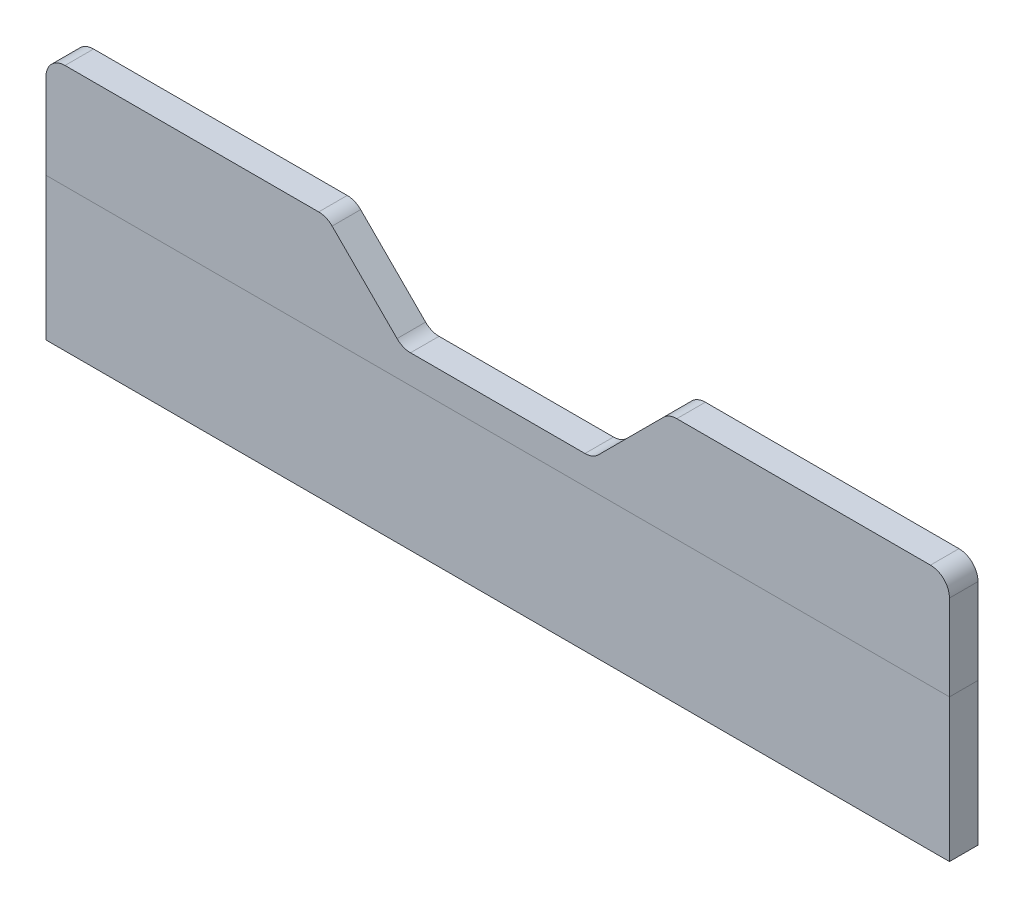
ISO-10303-21;
HEADER;
FILE_DESCRIPTION(('STEP AP214'),'2;1');
FILE_NAME('part.step','',(''),(''),'','','');
FILE_SCHEMA(('AUTOMOTIVE_DESIGN { 1 0 10303 214 1 1 1 1 }'));
ENDSEC;
DATA;
#1=APPLICATION_CONTEXT('core data for automotive mechanical design processes');
#2=APPLICATION_PROTOCOL_DEFINITION('international standard','automotive_design',2000,#1);
#3=PRODUCT_CONTEXT('',#1,'mechanical');
#4=PRODUCT('Part','Part','',(#3));
#5=PRODUCT_RELATED_PRODUCT_CATEGORY('part','',(#4));
#6=PRODUCT_DEFINITION_FORMATION('','',#4);
#7=PRODUCT_DEFINITION_CONTEXT('part definition',#1,'design');
#8=PRODUCT_DEFINITION('design','',#6,#7);
#9=PRODUCT_DEFINITION_SHAPE('','',#8);
#10=(LENGTH_UNIT() NAMED_UNIT(*) SI_UNIT(.MILLI.,.METRE.));
#11=(NAMED_UNIT(*) PLANE_ANGLE_UNIT() SI_UNIT($,.RADIAN.));
#12=(NAMED_UNIT(*) SI_UNIT($,.STERADIAN.) SOLID_ANGLE_UNIT());
#13=UNCERTAINTY_MEASURE_WITH_UNIT(LENGTH_MEASURE(1.E-05),#10,'distance_accuracy_value','');
#14=(GEOMETRIC_REPRESENTATION_CONTEXT(3) GLOBAL_UNCERTAINTY_ASSIGNED_CONTEXT((#13)) GLOBAL_UNIT_ASSIGNED_CONTEXT((#10,
#11,#12)) REPRESENTATION_CONTEXT('',''));
#15=CARTESIAN_POINT('',(0.,0.,0.));
#16=DIRECTION('',(0.,0.,1.));
#17=DIRECTION('',(1.,0.,0.));
#18=AXIS2_PLACEMENT_3D('',#15,#16,#17);
#19=CARTESIAN_POINT('',(0.,75.,-15.));
#20=DIRECTION('',(-1.,0.,0.));
#21=DIRECTION('',(0.,0.,1.));
#22=AXIS2_PLACEMENT_3D('',#19,#20,#21);
#23=PLANE('',#22);
#24=DIRECTION('',(0.,-1.,0.));
#25=VECTOR('',#24,1.);
#26=CARTESIAN_POINT('',(0.,75.,0.));
#27=LINE('',#26,#25);
#28=CARTESIAN_POINT('',(0.,120.,0.));
#29=VERTEX_POINT('',#28);
#30=CARTESIAN_POINT('',(0.,75.,0.));
#31=VERTEX_POINT('',#30);
#32=EDGE_CURVE('E196',#29,#31,#27,.T.);
#33=ORIENTED_EDGE('',*,*,#32,.F.);
#34=DIRECTION('',(0.,0.,1.));
#35=VECTOR('',#34,1.);
#36=CARTESIAN_POINT('',(0.,120.,-15.));
#37=LINE('',#36,#35);
#38=CARTESIAN_POINT('',(0.,120.,-15.));
#39=VERTEX_POINT('',#38);
#40=EDGE_CURVE('E162',#29,#39,#37,.F.);
#41=ORIENTED_EDGE('',*,*,#40,.T.);
#42=DIRECTION('',(0.,-1.,0.));
#43=VECTOR('',#42,1.);
#44=CARTESIAN_POINT('',(0.,75.,-15.));
#45=LINE('',#44,#43);
#46=CARTESIAN_POINT('',(0.,75.,-15.));
#47=VERTEX_POINT('',#46);
#48=EDGE_CURVE('E160',#39,#47,#45,.T.);
#49=ORIENTED_EDGE('',*,*,#48,.T.);
#50=DIRECTION('',(0.,0.,1.));
#51=VECTOR('',#50,1.);
#52=CARTESIAN_POINT('',(0.,75.,-15.));
#53=LINE('',#52,#51);
#54=EDGE_CURVE('E159',#47,#31,#53,.T.);
#55=ORIENTED_EDGE('',*,*,#54,.T.);
#56=EDGE_LOOP('',(#33,#41,#49,#55));
#57=FACE_BOUND('',#56,.T.);
#58=ADVANCED_FACE('F54',(#57),#23,.T.);
#59=CARTESIAN_POINT('',(0.,130.,-15.));
#60=DIRECTION('',(0.,1.,0.));
#61=DIRECTION('',(0.,0.,1.));
#62=AXIS2_PLACEMENT_3D('',#59,#60,#61);
#63=PLANE('',#62);
#64=DIRECTION('',(-1.,0.,0.));
#65=VECTOR('',#64,1.);
#66=CARTESIAN_POINT('',(0.,130.,-15.));
#67=LINE('',#66,#65);
#68=CARTESIAN_POINT('',(143.357864376269,130.,-15.));
#69=VERTEX_POINT('',#68);
#70=CARTESIAN_POINT('',(9.99999999999999,130.,-15.));
#71=VERTEX_POINT('',#70);
#72=EDGE_CURVE('E174',#69,#71,#67,.T.);
#73=ORIENTED_EDGE('',*,*,#72,.T.);
#74=DIRECTION('',(0.,0.,1.));
#75=VECTOR('',#74,1.);
#76=CARTESIAN_POINT('',(10.,130.,-15.));
#77=LINE('',#76,#75);
#78=CARTESIAN_POINT('',(9.99999999999999,130.,0.));
#79=VERTEX_POINT('',#78);
#80=EDGE_CURVE('E244',#71,#79,#77,.T.);
#81=ORIENTED_EDGE('',*,*,#80,.T.);
#82=DIRECTION('',(-1.,0.,0.));
#83=VECTOR('',#82,1.);
#84=CARTESIAN_POINT('',(0.,130.,0.));
#85=LINE('',#84,#83);
#86=CARTESIAN_POINT('',(143.357864376269,130.,0.));
#87=VERTEX_POINT('',#86);
#88=EDGE_CURVE('E170',#87,#79,#85,.T.);
#89=ORIENTED_EDGE('',*,*,#88,.F.);
#90=DIRECTION('',(0.,0.,1.));
#91=VECTOR('',#90,1.);
#92=CARTESIAN_POINT('',(143.357864376269,130.,-15.));
#93=LINE('',#92,#91);
#94=EDGE_CURVE('E242',#87,#69,#93,.F.);
#95=ORIENTED_EDGE('',*,*,#94,.T.);
#96=EDGE_LOOP('',(#73,#81,#89,#95));
#97=FACE_BOUND('',#96,.T.);
#98=ADVANCED_FACE('F308',(#97),#63,.T.);
#99=CARTESIAN_POINT('',(147.5,130.,-15.));
#100=DIRECTION('',(0.707106781186551,0.707106781186544,0.));
#101=DIRECTION('',(-0.707106781186544,0.707106781186551,0.));
#102=AXIS2_PLACEMENT_3D('',#99,#100,#101);
#103=PLANE('',#102);
#104=DIRECTION('',(-0.707106781186544,0.707106781186552,0.));
#105=VECTOR('',#104,1.);
#106=CARTESIAN_POINT('',(147.5,130.,0.));
#107=LINE('',#106,#105);
#108=CARTESIAN_POINT('',(184.571067811865,92.9289321881346,0.));
#109=VERTEX_POINT('',#108);
#110=CARTESIAN_POINT('',(150.428932188135,127.071067811865,0.));
#111=VERTEX_POINT('',#110);
#112=EDGE_CURVE('E213',#109,#111,#107,.T.);
#113=ORIENTED_EDGE('',*,*,#112,.F.);
#114=DIRECTION('',(0.,0.,1.));
#115=VECTOR('',#114,1.);
#116=CARTESIAN_POINT('',(184.571067811865,92.9289321881346,-15.));
#117=LINE('',#116,#115);
#118=CARTESIAN_POINT('',(184.571067811865,92.9289321881346,-15.));
#119=VERTEX_POINT('',#118);
#120=EDGE_CURVE('E261',#109,#119,#117,.F.);
#121=ORIENTED_EDGE('',*,*,#120,.T.);
#122=DIRECTION('',(-0.707106781186544,0.707106781186552,0.));
#123=VECTOR('',#122,1.);
#124=CARTESIAN_POINT('',(147.5,130.,-15.));
#125=LINE('',#124,#123);
#126=CARTESIAN_POINT('',(150.428932188135,127.071067811865,-15.));
#127=VERTEX_POINT('',#126);
#128=EDGE_CURVE('E194',#119,#127,#125,.T.);
#129=ORIENTED_EDGE('',*,*,#128,.T.);
#130=DIRECTION('',(0.,0.,1.));
#131=VECTOR('',#130,1.);
#132=CARTESIAN_POINT('',(150.428932188135,127.071067811865,-15.));
#133=LINE('',#132,#131);
#134=EDGE_CURVE('E256',#127,#111,#133,.T.);
#135=ORIENTED_EDGE('',*,*,#134,.T.);
#136=EDGE_LOOP('',(#113,#121,#129,#135));
#137=FACE_BOUND('',#136,.T.);
#138=ADVANCED_FACE('F272',(#137),#103,.T.);
#139=CARTESIAN_POINT('',(187.5,90.,-15.));
#140=DIRECTION('',(0.,1.,0.));
#141=DIRECTION('',(0.,0.,1.));
#142=AXIS2_PLACEMENT_3D('',#139,#140,#141);
#143=PLANE('',#142);
#144=DIRECTION('',(-1.,0.,0.));
#145=VECTOR('',#144,1.);
#146=CARTESIAN_POINT('',(187.5,90.,0.));
#147=LINE('',#146,#145);
#148=CARTESIAN_POINT('',(283.357864376269,90.,0.));
#149=VERTEX_POINT('',#148);
#150=CARTESIAN_POINT('',(191.642135623731,90.,0.));
#151=VERTEX_POINT('',#150);
#152=EDGE_CURVE('E209',#149,#151,#147,.T.);
#153=ORIENTED_EDGE('',*,*,#152,.F.);
#154=DIRECTION('',(0.,0.,1.));
#155=VECTOR('',#154,1.);
#156=CARTESIAN_POINT('',(283.357864376269,90.,-15.));
#157=LINE('',#156,#155);
#158=CARTESIAN_POINT('',(283.357864376269,90.,-15.));
#159=VERTEX_POINT('',#158);
#160=EDGE_CURVE('E258',#149,#159,#157,.F.);
#161=ORIENTED_EDGE('',*,*,#160,.T.);
#162=DIRECTION('',(-1.,0.,0.));
#163=VECTOR('',#162,1.);
#164=CARTESIAN_POINT('',(187.5,90.,-15.));
#165=LINE('',#164,#163);
#166=CARTESIAN_POINT('',(191.642135623731,90.,-15.));
#167=VERTEX_POINT('',#166);
#168=EDGE_CURVE('E189',#159,#167,#165,.T.);
#169=ORIENTED_EDGE('',*,*,#168,.T.);
#170=DIRECTION('',(0.,0.,1.));
#171=VECTOR('',#170,1.);
#172=CARTESIAN_POINT('',(191.642135623731,90.,0.));
#173=LINE('',#172,#171);
#174=EDGE_CURVE('E251',#167,#151,#173,.T.);
#175=ORIENTED_EDGE('',*,*,#174,.T.);
#176=EDGE_LOOP('',(#153,#161,#169,#175));
#177=FACE_BOUND('',#176,.T.);
#178=ADVANCED_FACE('F276',(#177),#143,.T.);
#179=CARTESIAN_POINT('',(327.5,130.,-15.));
#180=DIRECTION('',(-0.707106781186544,0.707106781186551,0.));
#181=DIRECTION('',(-0.707106781186551,-0.707106781186544,0.));
#182=AXIS2_PLACEMENT_3D('',#179,#180,#181);
#183=PLANE('',#182);
#184=DIRECTION('',(-0.707106781186551,-0.707106781186544,0.));
#185=VECTOR('',#184,1.);
#186=CARTESIAN_POINT('',(327.5,130.,0.));
#187=LINE('',#186,#185);
#188=CARTESIAN_POINT('',(324.571067811866,127.071067811866,0.));
#189=VERTEX_POINT('',#188);
#190=CARTESIAN_POINT('',(290.428932188135,92.9289321881345,0.));
#191=VERTEX_POINT('',#190);
#192=EDGE_CURVE('E210',#189,#191,#187,.T.);
#193=ORIENTED_EDGE('',*,*,#192,.F.);
#194=DIRECTION('',(0.,0.,1.));
#195=VECTOR('',#194,1.);
#196=CARTESIAN_POINT('',(324.571067811866,127.071067811866,-15.));
#197=LINE('',#196,#195);
#198=CARTESIAN_POINT('',(324.571067811866,127.071067811866,-15.));
#199=VERTEX_POINT('',#198);
#200=EDGE_CURVE('E80',#189,#199,#197,.F.);
#201=ORIENTED_EDGE('',*,*,#200,.T.);
#202=DIRECTION('',(-0.707106781186551,-0.707106781186544,0.));
#203=VECTOR('',#202,1.);
#204=CARTESIAN_POINT('',(327.5,130.,-15.));
#205=LINE('',#204,#203);
#206=CARTESIAN_POINT('',(290.428932188135,92.9289321881345,-15.));
#207=VERTEX_POINT('',#206);
#208=EDGE_CURVE('E187',#199,#207,#205,.T.);
#209=ORIENTED_EDGE('',*,*,#208,.T.);
#210=DIRECTION('',(0.,0.,1.));
#211=VECTOR('',#210,1.);
#212=CARTESIAN_POINT('',(290.428932188135,92.9289321881345,0.));
#213=LINE('',#212,#211);
#214=EDGE_CURVE('E246',#207,#191,#213,.T.);
#215=ORIENTED_EDGE('',*,*,#214,.T.);
#216=EDGE_LOOP('',(#193,#201,#209,#215));
#217=FACE_BOUND('',#216,.T.);
#218=ADVANCED_FACE('F283',(#217),#183,.T.);
#219=CARTESIAN_POINT('',(327.5,130.,-15.));
#220=DIRECTION('',(0.,1.,0.));
#221=DIRECTION('',(0.,0.,1.));
#222=AXIS2_PLACEMENT_3D('',#219,#220,#221);
#223=PLANE('',#222);
#224=DIRECTION('',(-1.,0.,0.));
#225=VECTOR('',#224,1.);
#226=CARTESIAN_POINT('',(327.5,130.,0.));
#227=LINE('',#226,#225);
#228=CARTESIAN_POINT('',(465.,130.,0.));
#229=VERTEX_POINT('',#228);
#230=CARTESIAN_POINT('',(331.642135623731,130.,0.));
#231=VERTEX_POINT('',#230);
#232=EDGE_CURVE('E204',#229,#231,#227,.T.);
#233=ORIENTED_EDGE('',*,*,#232,.F.);
#234=DIRECTION('',(0.,0.,1.));
#235=VECTOR('',#234,1.);
#236=CARTESIAN_POINT('',(465.,130.,-15.));
#237=LINE('',#236,#235);
#238=CARTESIAN_POINT('',(465.,130.,-15.));
#239=VERTEX_POINT('',#238);
#240=EDGE_CURVE('E234',#229,#239,#237,.F.);
#241=ORIENTED_EDGE('',*,*,#240,.T.);
#242=DIRECTION('',(-1.,0.,0.));
#243=VECTOR('',#242,1.);
#244=CARTESIAN_POINT('',(327.5,130.,-15.));
#245=LINE('',#244,#243);
#246=CARTESIAN_POINT('',(331.642135623731,130.,-15.));
#247=VERTEX_POINT('',#246);
#248=EDGE_CURVE('E181',#239,#247,#245,.T.);
#249=ORIENTED_EDGE('',*,*,#248,.T.);
#250=DIRECTION('',(0.,0.,1.));
#251=VECTOR('',#250,1.);
#252=CARTESIAN_POINT('',(331.642135623731,130.,-15.));
#253=LINE('',#252,#251);
#254=EDGE_CURVE('E229',#247,#231,#253,.T.);
#255=ORIENTED_EDGE('',*,*,#254,.T.);
#256=EDGE_LOOP('',(#233,#241,#249,#255));
#257=FACE_BOUND('',#256,.T.);
#258=ADVANCED_FACE('F292',(#257),#223,.T.);
#259=CARTESIAN_POINT('',(475.,75.,-15.));
#260=DIRECTION('',(1.,0.,0.));
#261=DIRECTION('',(0.,0.,-1.));
#262=AXIS2_PLACEMENT_3D('',#259,#260,#261);
#263=PLANE('',#262);
#264=DIRECTION('',(0.,1.,0.));
#265=VECTOR('',#264,1.);
#266=CARTESIAN_POINT('',(475.,75.,-15.));
#267=LINE('',#266,#265);
#268=CARTESIAN_POINT('',(475.,75.,-15.));
#269=VERTEX_POINT('',#268);
#270=CARTESIAN_POINT('',(475.,120.,-15.));
#271=VERTEX_POINT('',#270);
#272=EDGE_CURVE('E182',#269,#271,#267,.T.);
#273=ORIENTED_EDGE('',*,*,#272,.T.);
#274=DIRECTION('',(0.,0.,1.));
#275=VECTOR('',#274,1.);
#276=CARTESIAN_POINT('',(475.,120.,-15.));
#277=LINE('',#276,#275);
#278=CARTESIAN_POINT('',(475.,120.,0.));
#279=VERTEX_POINT('',#278);
#280=EDGE_CURVE('E217',#271,#279,#277,.T.);
#281=ORIENTED_EDGE('',*,*,#280,.T.);
#282=DIRECTION('',(0.,1.,0.));
#283=VECTOR('',#282,1.);
#284=CARTESIAN_POINT('',(475.,75.,0.));
#285=LINE('',#284,#283);
#286=CARTESIAN_POINT('',(475.,75.,0.));
#287=VERTEX_POINT('',#286);
#288=EDGE_CURVE('E203',#287,#279,#285,.T.);
#289=ORIENTED_EDGE('',*,*,#288,.F.);
#290=DIRECTION('',(0.,0.,1.));
#291=VECTOR('',#290,1.);
#292=CARTESIAN_POINT('',(475.,75.,-15.));
#293=LINE('',#292,#291);
#294=EDGE_CURVE('E173',#269,#287,#293,.T.);
#295=ORIENTED_EDGE('',*,*,#294,.F.);
#296=EDGE_LOOP('',(#273,#281,#289,#295));
#297=FACE_BOUND('',#296,.T.);
#298=ADVANCED_FACE('F298',(#297),#263,.T.);
#299=CARTESIAN_POINT('',(0.,75.,-15.));
#300=DIRECTION('',(0.,-1.,0.));
#301=DIRECTION('',(0.,0.,-1.));
#302=AXIS2_PLACEMENT_3D('',#299,#300,#301);
#303=PLANE('',#302);
#304=DIRECTION('',(1.,0.,0.));
#305=VECTOR('',#304,1.);
#306=CARTESIAN_POINT('',(0.,75.,0.));
#307=LINE('',#306,#305);
#308=EDGE_CURVE('E172',#31,#287,#307,.T.);
#309=ORIENTED_EDGE('',*,*,#308,.F.);
#310=ORIENTED_EDGE('',*,*,#54,.F.);
#311=DIRECTION('',(1.,0.,0.));
#312=VECTOR('',#311,1.);
#313=CARTESIAN_POINT('',(0.,75.,-15.));
#314=LINE('',#313,#312);
#315=EDGE_CURVE('E167',#47,#269,#314,.T.);
#316=ORIENTED_EDGE('',*,*,#315,.T.);
#317=ORIENTED_EDGE('',*,*,#294,.T.);
#318=EDGE_LOOP('',(#309,#310,#316,#317));
#319=FACE_BOUND('',#318,.T.);
#320=ADVANCED_FACE('F171',(#319),#303,.T.);
#321=CARTESIAN_POINT('',(0.,0.,-15.));
#322=DIRECTION('',(0.,0.,-1.));
#323=DIRECTION('',(-1.,0.,0.));
#324=AXIS2_PLACEMENT_3D('',#321,#322,#323);
#325=PLANE('',#324);
#326=ORIENTED_EDGE('',*,*,#248,.F.);
#327=CARTESIAN_POINT('',(465.,120.,-15.));
#328=DIRECTION('',(0.,0.,-1.));
#329=DIRECTION('',(-1.,0.,0.));
#330=AXIS2_PLACEMENT_3D('',#327,#328,#329);
#331=CIRCLE('',#330,10.);
#332=EDGE_CURVE('E241',#239,#271,#331,.T.);
#333=ORIENTED_EDGE('',*,*,#332,.T.);
#334=ORIENTED_EDGE('',*,*,#272,.F.);
#335=ORIENTED_EDGE('',*,*,#315,.F.);
#336=ORIENTED_EDGE('',*,*,#48,.F.);
#337=CARTESIAN_POINT('',(10.,120.,-15.));
#338=DIRECTION('',(0.,0.,-1.));
#339=DIRECTION('',(-1.,0.,0.));
#340=AXIS2_PLACEMENT_3D('',#337,#338,#339);
#341=CIRCLE('',#340,10.);
#342=EDGE_CURVE('E239',#39,#71,#341,.T.);
#343=ORIENTED_EDGE('',*,*,#342,.T.);
#344=ORIENTED_EDGE('',*,*,#72,.F.);
#345=CARTESIAN_POINT('',(143.357864376269,120.,-15.));
#346=DIRECTION('',(0.,0.,-1.));
#347=DIRECTION('',(-1.,0.,0.));
#348=AXIS2_PLACEMENT_3D('',#345,#346,#347);
#349=CIRCLE('',#348,10.);
#350=EDGE_CURVE('E233',#69,#127,#349,.T.);
#351=ORIENTED_EDGE('',*,*,#350,.T.);
#352=ORIENTED_EDGE('',*,*,#128,.F.);
#353=CARTESIAN_POINT('',(191.642135623731,100.,-15.));
#354=DIRECTION('',(0.,0.,-1.));
#355=DIRECTION('',(-1.,0.,0.));
#356=AXIS2_PLACEMENT_3D('',#353,#354,#355);
#357=CIRCLE('',#356,10.);
#358=EDGE_CURVE('E12',#119,#167,#357,.F.);
#359=ORIENTED_EDGE('',*,*,#358,.T.);
#360=ORIENTED_EDGE('',*,*,#168,.F.);
#361=CARTESIAN_POINT('',(283.357864376269,100.,-15.));
#362=DIRECTION('',(0.,0.,-1.));
#363=DIRECTION('',(-1.,0.,0.));
#364=AXIS2_PLACEMENT_3D('',#361,#362,#363);
#365=CIRCLE('',#364,10.);
#366=EDGE_CURVE('E68',#159,#207,#365,.F.);
#367=ORIENTED_EDGE('',*,*,#366,.T.);
#368=ORIENTED_EDGE('',*,*,#208,.F.);
#369=CARTESIAN_POINT('',(331.642135623731,120.,-15.));
#370=DIRECTION('',(0.,0.,-1.));
#371=DIRECTION('',(-1.,0.,0.));
#372=AXIS2_PLACEMENT_3D('',#369,#370,#371);
#373=CIRCLE('',#372,10.);
#374=EDGE_CURVE('E240',#199,#247,#373,.T.);
#375=ORIENTED_EDGE('',*,*,#374,.T.);
#376=EDGE_LOOP('',(#326,#333,#334,#335,#336,#343,#344,#351,#352,#359,#360,#367,#368,#375));
#377=FACE_BOUND('',#376,.T.);
#378=ADVANCED_FACE('F176',(#377),#325,.T.);
#379=CARTESIAN_POINT('',(0.,0.,0.));
#380=DIRECTION('',(0.,0.,-1.));
#381=DIRECTION('',(-1.,0.,0.));
#382=AXIS2_PLACEMENT_3D('',#379,#380,#381);
#383=PLANE('',#382);
#384=ORIENTED_EDGE('',*,*,#288,.T.);
#385=CARTESIAN_POINT('',(465.,120.,0.));
#386=DIRECTION('',(0.,0.,-1.));
#387=DIRECTION('',(-1.,0.,0.));
#388=AXIS2_PLACEMENT_3D('',#385,#386,#387);
#389=CIRCLE('',#388,10.);
#390=EDGE_CURVE('E227',#279,#229,#389,.F.);
#391=ORIENTED_EDGE('',*,*,#390,.T.);
#392=ORIENTED_EDGE('',*,*,#232,.T.);
#393=CARTESIAN_POINT('',(331.642135623731,120.,0.));
#394=DIRECTION('',(0.,0.,-1.));
#395=DIRECTION('',(-1.,0.,0.));
#396=AXIS2_PLACEMENT_3D('',#393,#394,#395);
#397=CIRCLE('',#396,10.);
#398=EDGE_CURVE('E221',#231,#189,#397,.F.);
#399=ORIENTED_EDGE('',*,*,#398,.T.);
#400=ORIENTED_EDGE('',*,*,#192,.T.);
#401=CARTESIAN_POINT('',(283.357864376269,100.,0.));
#402=DIRECTION('',(0.,0.,-1.));
#403=DIRECTION('',(-1.,0.,0.));
#404=AXIS2_PLACEMENT_3D('',#401,#402,#403);
#405=CIRCLE('',#404,10.);
#406=EDGE_CURVE('E263',#191,#149,#405,.T.);
#407=ORIENTED_EDGE('',*,*,#406,.T.);
#408=ORIENTED_EDGE('',*,*,#152,.T.);
#409=CARTESIAN_POINT('',(191.642135623731,100.,0.));
#410=DIRECTION('',(0.,0.,-1.));
#411=DIRECTION('',(-1.,0.,0.));
#412=AXIS2_PLACEMENT_3D('',#409,#410,#411);
#413=CIRCLE('',#412,10.);
#414=EDGE_CURVE('E62',#151,#109,#413,.T.);
#415=ORIENTED_EDGE('',*,*,#414,.T.);
#416=ORIENTED_EDGE('',*,*,#112,.T.);
#417=CARTESIAN_POINT('',(143.357864376269,120.,0.));
#418=DIRECTION('',(0.,0.,-1.));
#419=DIRECTION('',(-1.,0.,0.));
#420=AXIS2_PLACEMENT_3D('',#417,#418,#419);
#421=CIRCLE('',#420,10.);
#422=EDGE_CURVE('E225',#111,#87,#421,.F.);
#423=ORIENTED_EDGE('',*,*,#422,.T.);
#424=ORIENTED_EDGE('',*,*,#88,.T.);
#425=CARTESIAN_POINT('',(10.,120.,0.));
#426=DIRECTION('',(0.,0.,-1.));
#427=DIRECTION('',(-1.,0.,0.));
#428=AXIS2_PLACEMENT_3D('',#425,#426,#427);
#429=CIRCLE('',#428,10.);
#430=EDGE_CURVE('E226',#79,#29,#429,.F.);
#431=ORIENTED_EDGE('',*,*,#430,.T.);
#432=ORIENTED_EDGE('',*,*,#32,.T.);
#433=ORIENTED_EDGE('',*,*,#308,.T.);
#434=EDGE_LOOP('',(#384,#391,#392,#399,#400,#407,#408,#415,#416,#423,#424,#431,#432,#433));
#435=FACE_BOUND('',#434,.T.);
#436=ADVANCED_FACE('F270',(#435),#383,.F.);
#437=CARTESIAN_POINT('',(465.,120.,-15.));
#438=DIRECTION('',(0.,0.,1.));
#439=DIRECTION('',(1.,0.,0.));
#440=AXIS2_PLACEMENT_3D('',#437,#438,#439);
#441=CYLINDRICAL_SURFACE('',#440,10.);
#442=ORIENTED_EDGE('',*,*,#332,.F.);
#443=ORIENTED_EDGE('',*,*,#240,.F.);
#444=ORIENTED_EDGE('',*,*,#390,.F.);
#445=ORIENTED_EDGE('',*,*,#280,.F.);
#446=EDGE_LOOP('',(#442,#443,#444,#445));
#447=FACE_BOUND('',#446,.T.);
#448=ADVANCED_FACE('F296',(#447),#441,.T.);
#449=CARTESIAN_POINT('',(10.,120.,-15.));
#450=DIRECTION('',(0.,0.,1.));
#451=DIRECTION('',(1.,0.,0.));
#452=AXIS2_PLACEMENT_3D('',#449,#450,#451);
#453=CYLINDRICAL_SURFACE('',#452,10.);
#454=ORIENTED_EDGE('',*,*,#342,.F.);
#455=ORIENTED_EDGE('',*,*,#40,.F.);
#456=ORIENTED_EDGE('',*,*,#430,.F.);
#457=ORIENTED_EDGE('',*,*,#80,.F.);
#458=EDGE_LOOP('',(#454,#455,#456,#457));
#459=FACE_BOUND('',#458,.T.);
#460=ADVANCED_FACE('F302',(#459),#453,.T.);
#461=CARTESIAN_POINT('',(331.642135623731,120.,-15.));
#462=DIRECTION('',(0.,0.,1.));
#463=DIRECTION('',(1.,0.,0.));
#464=AXIS2_PLACEMENT_3D('',#461,#462,#463);
#465=CYLINDRICAL_SURFACE('',#464,10.);
#466=ORIENTED_EDGE('',*,*,#374,.F.);
#467=ORIENTED_EDGE('',*,*,#200,.F.);
#468=ORIENTED_EDGE('',*,*,#398,.F.);
#469=ORIENTED_EDGE('',*,*,#254,.F.);
#470=EDGE_LOOP('',(#466,#467,#468,#469));
#471=FACE_BOUND('',#470,.T.);
#472=ADVANCED_FACE('F286',(#471),#465,.T.);
#473=CARTESIAN_POINT('',(283.357864376269,100.,-15.));
#474=DIRECTION('',(0.,0.,-1.));
#475=DIRECTION('',(-1.,0.,0.));
#476=AXIS2_PLACEMENT_3D('',#473,#474,#475);
#477=CYLINDRICAL_SURFACE('',#476,10.);
#478=ORIENTED_EDGE('',*,*,#366,.F.);
#479=ORIENTED_EDGE('',*,*,#160,.F.);
#480=ORIENTED_EDGE('',*,*,#406,.F.);
#481=ORIENTED_EDGE('',*,*,#214,.F.);
#482=EDGE_LOOP('',(#478,#479,#480,#481));
#483=FACE_BOUND('',#482,.T.);
#484=ADVANCED_FACE('F285',(#483),#477,.F.);
#485=CARTESIAN_POINT('',(191.642135623731,100.,-15.));
#486=DIRECTION('',(0.,0.,-1.));
#487=DIRECTION('',(-1.,0.,0.));
#488=AXIS2_PLACEMENT_3D('',#485,#486,#487);
#489=CYLINDRICAL_SURFACE('',#488,10.);
#490=ORIENTED_EDGE('',*,*,#358,.F.);
#491=ORIENTED_EDGE('',*,*,#120,.F.);
#492=ORIENTED_EDGE('',*,*,#414,.F.);
#493=ORIENTED_EDGE('',*,*,#174,.F.);
#494=EDGE_LOOP('',(#490,#491,#492,#493));
#495=FACE_BOUND('',#494,.T.);
#496=ADVANCED_FACE('F280',(#495),#489,.F.);
#497=CARTESIAN_POINT('',(143.357864376269,120.,-15.));
#498=DIRECTION('',(0.,0.,1.));
#499=DIRECTION('',(1.,0.,0.));
#500=AXIS2_PLACEMENT_3D('',#497,#498,#499);
#501=CYLINDRICAL_SURFACE('',#500,10.);
#502=ORIENTED_EDGE('',*,*,#350,.F.);
#503=ORIENTED_EDGE('',*,*,#94,.F.);
#504=ORIENTED_EDGE('',*,*,#422,.F.);
#505=ORIENTED_EDGE('',*,*,#134,.F.);
#506=EDGE_LOOP('',(#502,#503,#504,#505));
#507=FACE_BOUND('',#506,.T.);
#508=ADVANCED_FACE('F60',(#507),#501,.T.);
#509=CLOSED_SHELL('',(#58,#98,#138,#178,#218,#258,#298,#320,#378,#436,#448,#460,#472,#484,#496,#508));
#510=MANIFOLD_SOLID_BREP('B2',#509);
#511=CARTESIAN_POINT('',(0.,0.,-15.));
#512=DIRECTION('',(-1.,0.,0.));
#513=DIRECTION('',(0.,0.,1.));
#514=AXIS2_PLACEMENT_3D('',#511,#512,#513);
#515=PLANE('',#514);
#516=DIRECTION('',(0.,-1.,0.));
#517=VECTOR('',#516,1.);
#518=CARTESIAN_POINT('',(0.,0.,0.));
#519=LINE('',#518,#517);
#520=CARTESIAN_POINT('',(0.,75.,0.));
#521=VERTEX_POINT('',#520);
#522=CARTESIAN_POINT('',(0.,0.,0.));
#523=VERTEX_POINT('',#522);
#524=EDGE_CURVE('E502',#521,#523,#519,.T.);
#525=ORIENTED_EDGE('',*,*,#524,.F.);
#526=DIRECTION('',(0.,0.,1.));
#527=VECTOR('',#526,1.);
#528=CARTESIAN_POINT('',(0.,75.,-15.));
#529=LINE('',#528,#527);
#530=CARTESIAN_POINT('',(0.,75.,-15.));
#531=VERTEX_POINT('',#530);
#532=EDGE_CURVE('E52',#531,#521,#529,.T.);
#533=ORIENTED_EDGE('',*,*,#532,.F.);
#534=DIRECTION('',(0.,-1.,0.));
#535=VECTOR('',#534,1.);
#536=CARTESIAN_POINT('',(0.,0.,-15.));
#537=LINE('',#536,#535);
#538=CARTESIAN_POINT('',(0.,0.,-15.));
#539=VERTEX_POINT('',#538);
#540=EDGE_CURVE('E500',#531,#539,#537,.T.);
#541=ORIENTED_EDGE('',*,*,#540,.T.);
#542=DIRECTION('',(0.,0.,1.));
#543=VECTOR('',#542,1.);
#544=CARTESIAN_POINT('',(0.,0.,-15.));
#545=LINE('',#544,#543);
#546=EDGE_CURVE('E445',#539,#523,#545,.T.);
#547=ORIENTED_EDGE('',*,*,#546,.T.);
#548=EDGE_LOOP('',(#525,#533,#541,#547));
#549=FACE_BOUND('',#548,.T.);
#550=ADVANCED_FACE('F438',(#549),#515,.T.);
#551=CARTESIAN_POINT('',(0.,75.,-15.));
#552=DIRECTION('',(0.,1.,0.));
#553=DIRECTION('',(0.,0.,1.));
#554=AXIS2_PLACEMENT_3D('',#551,#552,#553);
#555=PLANE('',#554);
#556=DIRECTION('',(-1.,0.,0.));
#557=VECTOR('',#556,1.);
#558=CARTESIAN_POINT('',(0.,75.,0.));
#559=LINE('',#558,#557);
#560=CARTESIAN_POINT('',(475.,75.,0.));
#561=VERTEX_POINT('',#560);
#562=EDGE_CURVE('E496',#561,#521,#559,.T.);
#563=ORIENTED_EDGE('',*,*,#562,.F.);
#564=DIRECTION('',(0.,0.,1.));
#565=VECTOR('',#564,1.);
#566=CARTESIAN_POINT('',(475.,75.,-15.));
#567=LINE('',#566,#565);
#568=CARTESIAN_POINT('',(475.,75.,-15.));
#569=VERTEX_POINT('',#568);
#570=EDGE_CURVE('E447',#569,#561,#567,.T.);
#571=ORIENTED_EDGE('',*,*,#570,.F.);
#572=DIRECTION('',(-1.,0.,0.));
#573=VECTOR('',#572,1.);
#574=CARTESIAN_POINT('',(0.,75.,-15.));
#575=LINE('',#574,#573);
#576=EDGE_CURVE('E493',#569,#531,#575,.T.);
#577=ORIENTED_EDGE('',*,*,#576,.T.);
#578=ORIENTED_EDGE('',*,*,#532,.T.);
#579=EDGE_LOOP('',(#563,#571,#577,#578));
#580=FACE_BOUND('',#579,.T.);
#581=ADVANCED_FACE('F511',(#580),#555,.T.);
#582=CARTESIAN_POINT('',(475.,0.,-15.));
#583=DIRECTION('',(1.,0.,0.));
#584=DIRECTION('',(0.,0.,-1.));
#585=AXIS2_PLACEMENT_3D('',#582,#583,#584);
#586=PLANE('',#585);
#587=DIRECTION('',(0.,1.,0.));
#588=VECTOR('',#587,1.);
#589=CARTESIAN_POINT('',(475.,0.,0.));
#590=LINE('',#589,#588);
#591=CARTESIAN_POINT('',(475.,0.,0.));
#592=VERTEX_POINT('',#591);
#593=EDGE_CURVE('E487',#592,#561,#590,.T.);
#594=ORIENTED_EDGE('',*,*,#593,.F.);
#595=DIRECTION('',(0.,0.,1.));
#596=VECTOR('',#595,1.);
#597=CARTESIAN_POINT('',(475.,0.,-15.));
#598=LINE('',#597,#596);
#599=CARTESIAN_POINT('',(475.,0.,-15.));
#600=VERTEX_POINT('',#599);
#601=EDGE_CURVE('E482',#600,#592,#598,.T.);
#602=ORIENTED_EDGE('',*,*,#601,.F.);
#603=DIRECTION('',(0.,1.,0.));
#604=VECTOR('',#603,1.);
#605=CARTESIAN_POINT('',(475.,0.,-15.));
#606=LINE('',#605,#604);
#607=EDGE_CURVE('E490',#600,#569,#606,.T.);
#608=ORIENTED_EDGE('',*,*,#607,.T.);
#609=ORIENTED_EDGE('',*,*,#570,.T.);
#610=EDGE_LOOP('',(#594,#602,#608,#609));
#611=FACE_BOUND('',#610,.T.);
#612=ADVANCED_FACE('F486',(#611),#586,.T.);
#613=CARTESIAN_POINT('',(0.,0.,-15.));
#614=DIRECTION('',(0.,-1.,0.));
#615=DIRECTION('',(0.,0.,-1.));
#616=AXIS2_PLACEMENT_3D('',#613,#614,#615);
#617=PLANE('',#616);
#618=DIRECTION('',(1.,0.,0.));
#619=VECTOR('',#618,1.);
#620=CARTESIAN_POINT('',(0.,0.,0.));
#621=LINE('',#620,#619);
#622=EDGE_CURVE('E507',#523,#592,#621,.T.);
#623=ORIENTED_EDGE('',*,*,#622,.F.);
#624=ORIENTED_EDGE('',*,*,#546,.F.);
#625=DIRECTION('',(1.,0.,0.));
#626=VECTOR('',#625,1.);
#627=CARTESIAN_POINT('',(0.,0.,-15.));
#628=LINE('',#627,#626);
#629=EDGE_CURVE('E492',#539,#600,#628,.T.);
#630=ORIENTED_EDGE('',*,*,#629,.T.);
#631=ORIENTED_EDGE('',*,*,#601,.T.);
#632=EDGE_LOOP('',(#623,#624,#630,#631));
#633=FACE_BOUND('',#632,.T.);
#634=ADVANCED_FACE('F497',(#633),#617,.T.);
#635=CARTESIAN_POINT('',(0.,0.,-15.));
#636=DIRECTION('',(0.,0.,-1.));
#637=DIRECTION('',(-1.,0.,0.));
#638=AXIS2_PLACEMENT_3D('',#635,#636,#637);
#639=PLANE('',#638);
#640=ORIENTED_EDGE('',*,*,#540,.F.);
#641=ORIENTED_EDGE('',*,*,#576,.F.);
#642=ORIENTED_EDGE('',*,*,#607,.F.);
#643=ORIENTED_EDGE('',*,*,#629,.F.);
#644=EDGE_LOOP('',(#640,#641,#642,#643));
#645=FACE_BOUND('',#644,.T.);
#646=ADVANCED_FACE('F495',(#645),#639,.T.);
#647=CARTESIAN_POINT('',(0.,0.,0.));
#648=DIRECTION('',(0.,0.,-1.));
#649=DIRECTION('',(-1.,0.,0.));
#650=AXIS2_PLACEMENT_3D('',#647,#648,#649);
#651=PLANE('',#650);
#652=ORIENTED_EDGE('',*,*,#524,.T.);
#653=ORIENTED_EDGE('',*,*,#622,.T.);
#654=ORIENTED_EDGE('',*,*,#593,.T.);
#655=ORIENTED_EDGE('',*,*,#562,.T.);
#656=EDGE_LOOP('',(#652,#653,#654,#655));
#657=FACE_BOUND('',#656,.T.);
#658=ADVANCED_FACE('F515',(#657),#651,.F.);
#659=CLOSED_SHELL('',(#550,#581,#612,#634,#646,#658));
#660=MANIFOLD_SOLID_BREP('B6',#659);
#661=ADVANCED_BREP_SHAPE_REPRESENTATION('',(#18,#510,#660),#14);
#662=SHAPE_DEFINITION_REPRESENTATION(#9,#661);
ENDSEC;
END-ISO-10303-21;
